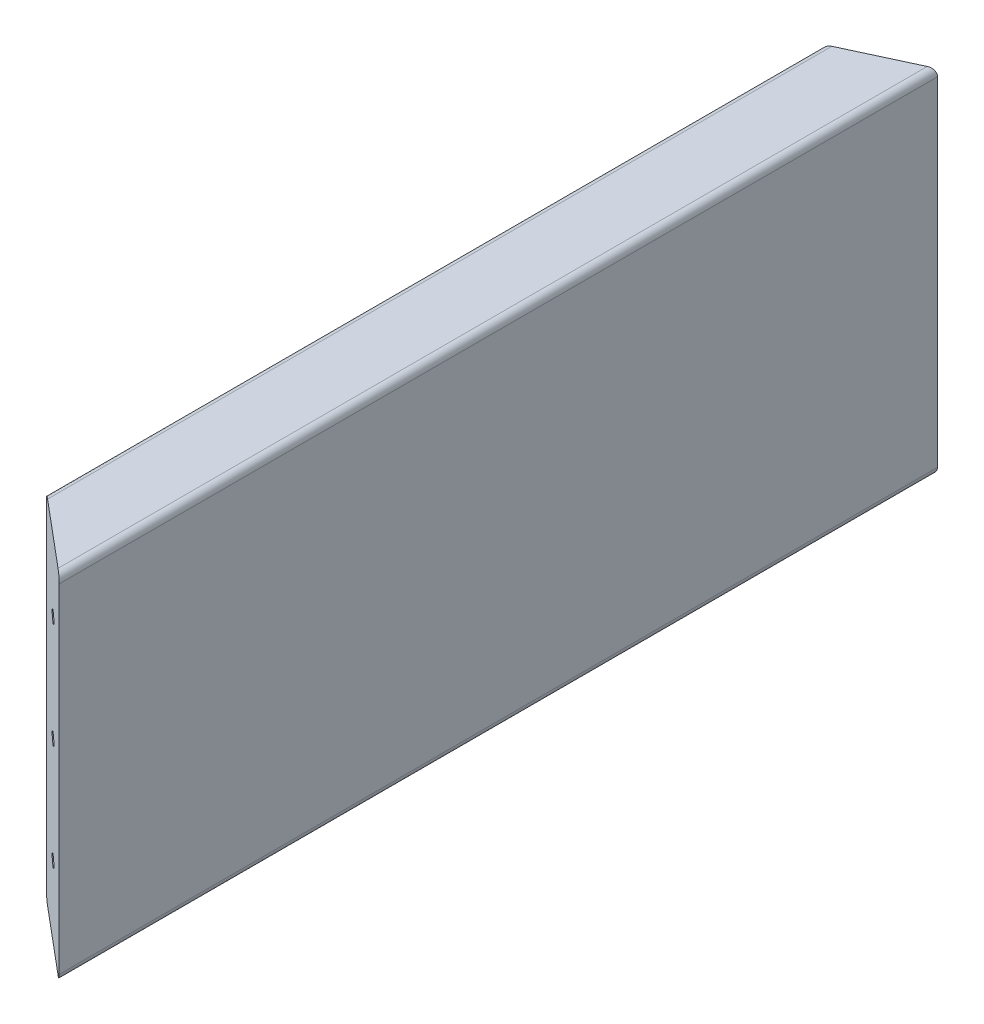
ISO-10303-21;
HEADER;
FILE_DESCRIPTION(('STEP AP214'),'2;1');
FILE_NAME('part.step','',(''),(''),'','','');
FILE_SCHEMA(('AUTOMOTIVE_DESIGN { 1 0 10303 214 1 1 1 1 }'));
ENDSEC;
DATA;
#1=APPLICATION_CONTEXT('core data for automotive mechanical design processes');
#2=APPLICATION_PROTOCOL_DEFINITION('international standard','automotive_design',2000,#1);
#3=PRODUCT_CONTEXT('',#1,'mechanical');
#4=PRODUCT('Part','Part','',(#3));
#5=PRODUCT_RELATED_PRODUCT_CATEGORY('part','',(#4));
#6=PRODUCT_DEFINITION_FORMATION('','',#4);
#7=PRODUCT_DEFINITION_CONTEXT('part definition',#1,'design');
#8=PRODUCT_DEFINITION('design','',#6,#7);
#9=PRODUCT_DEFINITION_SHAPE('','',#8);
#10=(LENGTH_UNIT() NAMED_UNIT(*) SI_UNIT(.MILLI.,.METRE.));
#11=(NAMED_UNIT(*) PLANE_ANGLE_UNIT() SI_UNIT($,.RADIAN.));
#12=(NAMED_UNIT(*) SI_UNIT($,.STERADIAN.) SOLID_ANGLE_UNIT());
#13=UNCERTAINTY_MEASURE_WITH_UNIT(LENGTH_MEASURE(1.E-05),#10,'distance_accuracy_value','');
#14=(GEOMETRIC_REPRESENTATION_CONTEXT(3) GLOBAL_UNCERTAINTY_ASSIGNED_CONTEXT((#13)) GLOBAL_UNIT_ASSIGNED_CONTEXT((#10,
#11,#12)) REPRESENTATION_CONTEXT('',''));
#15=CARTESIAN_POINT('',(0.,0.,0.));
#16=DIRECTION('',(0.,0.,1.));
#17=DIRECTION('',(1.,0.,0.));
#18=AXIS2_PLACEMENT_3D('',#15,#16,#17);
#19=CARTESIAN_POINT('',(-31.1882554112285,134.272684877163,510.));
#20=DIRECTION('',(0.,-1.,0.));
#21=DIRECTION('',(0.,0.,-1.));
#22=AXIS2_PLACEMENT_3D('',#19,#20,#21);
#23=PLANE('',#22);
#24=DIRECTION('',(0.907126965711573,0.,-0.420857063715122));
#25=VECTOR('',#24,1.);
#26=CARTESIAN_POINT('',(-217.92092886283,134.272684877163,107.511226324524));
#27=LINE('',#26,#25);
#28=CARTESIAN_POINT('',(-27.1882554112285,134.272684877163,19.0217469709818));
#29=VERTEX_POINT('',#28);
#30=CARTESIAN_POINT('',(9.81174458877147,134.272684877163,1.85578019229093));
#31=VERTEX_POINT('',#30);
#32=EDGE_CURVE('E49',#29,#31,#27,.T.);
#33=ORIENTED_EDGE('',*,*,#32,.F.);
#34=DIRECTION('',(0.,0.,-1.));
#35=VECTOR('',#34,1.);
#36=CARTESIAN_POINT('',(-27.1882554112285,134.272684877163,510.));
#37=LINE('',#36,#35);
#38=CARTESIAN_POINT('',(-27.1882554112285,134.272684877163,464.274109805575));
#39=VERTEX_POINT('',#38);
#40=EDGE_CURVE('E41',#29,#39,#37,.F.);
#41=ORIENTED_EDGE('',*,*,#40,.T.);
#42=DIRECTION('',(-0.766068203582476,0.,-0.642759292005894));
#43=VECTOR('',#42,1.);
#44=CARTESIAN_POINT('',(-7.02038536886983,134.272684877163,481.195691734014));
#45=LINE('',#44,#43);
#46=CARTESIAN_POINT('',(9.81174458877147,134.272684877163,495.318465507851));
#47=VERTEX_POINT('',#46);
#48=EDGE_CURVE('E216',#47,#39,#45,.T.);
#49=ORIENTED_EDGE('',*,*,#48,.F.);
#50=DIRECTION('',(0.,0.,-1.));
#51=VECTOR('',#50,1.);
#52=CARTESIAN_POINT('',(9.81174458877147,134.272684877163,510.));
#53=LINE('',#52,#51);
#54=EDGE_CURVE('E251',#47,#31,#53,.T.);
#55=ORIENTED_EDGE('',*,*,#54,.T.);
#56=EDGE_LOOP('',(#33,#41,#49,#55));
#57=FACE_BOUND('',#56,.T.);
#58=ADVANCED_FACE('F32',(#57),#23,.F.);
#59=CARTESIAN_POINT('',(-31.1882554112285,-65.7273151228369,510.));
#60=DIRECTION('',(0.,1.,0.));
#61=DIRECTION('',(0.,0.,1.));
#62=AXIS2_PLACEMENT_3D('',#59,#60,#61);
#63=PLANE('',#62);
#64=CARTESIAN_POINT('',(-8.11900232288232,-65.7273151228369,35.1370040691663));
#65=DIRECTION('',(0.,1.,0.));
#66=DIRECTION('',(0.,0.,1.));
#67=AXIS2_PLACEMENT_3D('',#64,#65,#66);
#68=CIRCLE('',#67,2.99999999999999);
#69=CARTESIAN_POINT('',(-8.11900232288232,-65.7273151228369,38.1370040691663));
#70=VERTEX_POINT('',#69);
#71=EDGE_CURVE('E36',#70,#70,#68,.T.);
#72=ORIENTED_EDGE('',*,*,#71,.T.);
#73=EDGE_LOOP('',(#72));
#74=FACE_BOUND('',#73,.T.);
#75=CARTESIAN_POINT('',(-8.08623886436544,-65.7273151228369,450.935611492298));
#76=DIRECTION('',(0.,1.,0.));
#77=DIRECTION('',(0.,0.,1.));
#78=AXIS2_PLACEMENT_3D('',#75,#76,#77);
#79=CIRCLE('',#78,2.99999999999999);
#80=CARTESIAN_POINT('',(-8.08623886436544,-65.7273151228369,453.935611492298));
#81=VERTEX_POINT('',#80);
#82=EDGE_CURVE('E144',#81,#81,#79,.T.);
#83=ORIENTED_EDGE('',*,*,#82,.T.);
#84=EDGE_LOOP('',(#83));
#85=FACE_BOUND('',#84,.T.);
#86=CARTESIAN_POINT('',(-8.11082335994362,-65.7273151228369,138.935612460884));
#87=DIRECTION('',(0.,1.,0.));
#88=DIRECTION('',(0.,0.,1.));
#89=AXIS2_PLACEMENT_3D('',#86,#87,#88);
#90=CIRCLE('',#89,2.99999999999999);
#91=CARTESIAN_POINT('',(-8.11082335994362,-65.7273151228369,141.935612460884));
#92=VERTEX_POINT('',#91);
#93=EDGE_CURVE('E148',#92,#92,#90,.T.);
#94=ORIENTED_EDGE('',*,*,#93,.T.);
#95=EDGE_LOOP('',(#94));
#96=FACE_BOUND('',#95,.T.);
#97=CARTESIAN_POINT('',(-8.10262852808386,-65.7273151228369,242.935612138022));
#98=DIRECTION('',(0.,1.,0.));
#99=DIRECTION('',(0.,0.,1.));
#100=AXIS2_PLACEMENT_3D('',#97,#98,#99);
#101=CIRCLE('',#100,2.99999999999999);
#102=CARTESIAN_POINT('',(-8.10262852808386,-65.7273151228369,245.935612138022));
#103=VERTEX_POINT('',#102);
#104=EDGE_CURVE('E152',#103,#103,#101,.T.);
#105=ORIENTED_EDGE('',*,*,#104,.T.);
#106=EDGE_LOOP('',(#105));
#107=FACE_BOUND('',#106,.T.);
#108=CARTESIAN_POINT('',(-8.09443369622476,-65.7273151228369,346.93561181516));
#109=DIRECTION('',(0.,1.,0.));
#110=DIRECTION('',(0.,0.,1.));
#111=AXIS2_PLACEMENT_3D('',#108,#109,#110);
#112=CIRCLE('',#111,2.99999999999999);
#113=CARTESIAN_POINT('',(-8.09443369622476,-65.7273151228369,349.93561181516));
#114=VERTEX_POINT('',#113);
#115=EDGE_CURVE('E156',#114,#114,#112,.T.);
#116=ORIENTED_EDGE('',*,*,#115,.T.);
#117=EDGE_LOOP('',(#116));
#118=FACE_BOUND('',#117,.T.);
#119=DIRECTION('',(-0.907126965711573,0.,0.420857063715122));
#120=VECTOR('',#119,1.);
#121=CARTESIAN_POINT('',(-217.92092886283,-65.7273151228369,107.511226324524));
#122=LINE('',#121,#120);
#123=CARTESIAN_POINT('',(9.81174458877147,-65.7273151228369,1.85578019229093));
#124=VERTEX_POINT('',#123);
#125=CARTESIAN_POINT('',(-27.1882554112285,-65.7273151228369,19.0217469709818));
#126=VERTEX_POINT('',#125);
#127=EDGE_CURVE('E208',#124,#126,#122,.T.);
#128=ORIENTED_EDGE('',*,*,#127,.F.);
#129=DIRECTION('',(0.,0.,-1.));
#130=VECTOR('',#129,1.);
#131=CARTESIAN_POINT('',(9.81174458877147,-65.7273151228369,510.));
#132=LINE('',#131,#130);
#133=CARTESIAN_POINT('',(9.81174458877147,-65.7273151228369,495.318465507851));
#134=VERTEX_POINT('',#133);
#135=EDGE_CURVE('E235',#124,#134,#132,.F.);
#136=ORIENTED_EDGE('',*,*,#135,.T.);
#137=DIRECTION('',(0.766068203582476,0.,0.642759292005894));
#138=VECTOR('',#137,1.);
#139=CARTESIAN_POINT('',(-7.02038536886982,-65.7273151228369,481.195691734014));
#140=LINE('',#139,#138);
#141=CARTESIAN_POINT('',(-27.1882554112285,-65.7273151228369,464.274109805575));
#142=VERTEX_POINT('',#141);
#143=EDGE_CURVE('E226',#142,#134,#140,.T.);
#144=ORIENTED_EDGE('',*,*,#143,.F.);
#145=DIRECTION('',(0.,0.,-1.));
#146=VECTOR('',#145,1.);
#147=CARTESIAN_POINT('',(-27.1882554112285,-65.7273151228369,510.));
#148=LINE('',#147,#146);
#149=EDGE_CURVE('E237',#142,#126,#148,.T.);
#150=ORIENTED_EDGE('',*,*,#149,.T.);
#151=EDGE_LOOP('',(#128,#136,#144,#150));
#152=FACE_BOUND('',#151,.T.);
#153=ADVANCED_FACE('F269',(#74,#85,#96,#107,#118,#152),#63,.F.);
#154=CARTESIAN_POINT('',(-27.1882554112285,-61.7273151228369,510.));
#155=DIRECTION('',(0.,0.,-1.));
#156=DIRECTION('',(-1.,0.,0.));
#157=AXIS2_PLACEMENT_3D('',#154,#155,#156);
#158=CYLINDRICAL_SURFACE('',#157,4.);
#159=DIRECTION('',(0.,0.,-1.));
#160=VECTOR('',#159,1.);
#161=CARTESIAN_POINT('',(-31.1882554112285,-61.7273151228369,510.));
#162=LINE('',#161,#160);
#163=CARTESIAN_POINT('',(-31.1882554112285,-61.7273151228369,20.8775271632726));
#164=VERTEX_POINT('',#163);
#165=CARTESIAN_POINT('',(-31.1882554112285,-61.7273151228369,460.917963243167));
#166=VERTEX_POINT('',#165);
#167=EDGE_CURVE('E243',#164,#166,#162,.F.);
#168=ORIENTED_EDGE('',*,*,#167,.F.);
#169=CARTESIAN_POINT('',(-27.1882554112285,-61.7273151228369,19.0217469709817));
#170=DIRECTION('',(-0.420857063715122,0.,-0.907126965711573));
#171=DIRECTION('',(0.907126965711573,0.,-0.420857063715122));
#172=AXIS2_PLACEMENT_3D('',#169,#170,#171);
#173=ELLIPSE('',#172,4.40952606547453,4.);
#174=EDGE_CURVE('E210',#164,#126,#173,.F.);
#175=ORIENTED_EDGE('',*,*,#174,.T.);
#176=ORIENTED_EDGE('',*,*,#149,.F.);
#177=CARTESIAN_POINT('',(-27.1882554112285,-61.7273151228369,464.274109805575));
#178=DIRECTION('',(-0.642759292005894,0.,0.766068203582476));
#179=DIRECTION('',(-0.766068203582476,0.,-0.642759292005894));
#180=AXIS2_PLACEMENT_3D('',#177,#178,#179);
#181=ELLIPSE('',#180,5.22146720265143,4.);
#182=EDGE_CURVE('E229',#142,#166,#181,.F.);
#183=ORIENTED_EDGE('',*,*,#182,.T.);
#184=EDGE_LOOP('',(#168,#175,#176,#183));
#185=FACE_BOUND('',#184,.T.);
#186=ADVANCED_FACE('F295',(#185),#158,.T.);
#187=CARTESIAN_POINT('',(9.81174458877148,-61.7273151228369,510.));
#188=DIRECTION('',(0.,0.,-1.));
#189=DIRECTION('',(-1.,0.,0.));
#190=AXIS2_PLACEMENT_3D('',#187,#188,#189);
#191=CYLINDRICAL_SURFACE('',#190,4.);
#192=ORIENTED_EDGE('',*,*,#135,.F.);
#193=CARTESIAN_POINT('',(9.81174458877148,-61.7273151228369,1.85578019229093));
#194=DIRECTION('',(-0.420857063715122,0.,-0.907126965711573));
#195=DIRECTION('',(0.907126965711573,0.,-0.420857063715122));
#196=AXIS2_PLACEMENT_3D('',#193,#194,#195);
#197=ELLIPSE('',#196,4.40952606547453,4.);
#198=CARTESIAN_POINT('',(13.8117445887715,-61.7273151228369,0.));
#199=VERTEX_POINT('',#198);
#200=EDGE_CURVE('E205',#124,#199,#197,.F.);
#201=ORIENTED_EDGE('',*,*,#200,.T.);
#202=DIRECTION('',(0.,0.,-1.));
#203=VECTOR('',#202,1.);
#204=CARTESIAN_POINT('',(13.8117445887715,-61.7273151228369,510.));
#205=LINE('',#204,#203);
#206=CARTESIAN_POINT('',(13.8117445887715,-61.7273151228369,498.674612070259));
#207=VERTEX_POINT('',#206);
#208=EDGE_CURVE('E248',#207,#199,#205,.T.);
#209=ORIENTED_EDGE('',*,*,#208,.F.);
#210=CARTESIAN_POINT('',(9.81174458877148,-61.7273151228369,495.318465507851));
#211=DIRECTION('',(-0.642759292005894,0.,0.766068203582476));
#212=DIRECTION('',(-0.766068203582476,0.,-0.642759292005894));
#213=AXIS2_PLACEMENT_3D('',#210,#211,#212);
#214=ELLIPSE('',#213,5.22146720265143,4.);
#215=EDGE_CURVE('E223',#207,#134,#214,.F.);
#216=ORIENTED_EDGE('',*,*,#215,.T.);
#217=EDGE_LOOP('',(#192,#201,#209,#216));
#218=FACE_BOUND('',#217,.T.);
#219=ADVANCED_FACE('F303',(#218),#191,.T.);
#220=CARTESIAN_POINT('',(-27.1882554112285,130.272684877163,510.));
#221=DIRECTION('',(0.,0.,-1.));
#222=DIRECTION('',(-1.,0.,0.));
#223=AXIS2_PLACEMENT_3D('',#220,#221,#222);
#224=CYLINDRICAL_SURFACE('',#223,4.);
#225=ORIENTED_EDGE('',*,*,#40,.F.);
#226=CARTESIAN_POINT('',(-27.1882554112285,130.272684877163,19.0217469709817));
#227=DIRECTION('',(-0.420857063715122,0.,-0.907126965711573));
#228=DIRECTION('',(0.907126965711573,0.,-0.420857063715122));
#229=AXIS2_PLACEMENT_3D('',#226,#227,#228);
#230=ELLIPSE('',#229,4.40952606547453,4.);
#231=CARTESIAN_POINT('',(-31.1882554112285,130.272684877163,20.8775271632726));
#232=VERTEX_POINT('',#231);
#233=EDGE_CURVE('E202',#29,#232,#230,.F.);
#234=ORIENTED_EDGE('',*,*,#233,.T.);
#235=DIRECTION('',(0.,0.,-1.));
#236=VECTOR('',#235,1.);
#237=CARTESIAN_POINT('',(-31.1882554112285,130.272684877163,510.));
#238=LINE('',#237,#236);
#239=CARTESIAN_POINT('',(-31.1882554112285,130.272684877163,460.917963243167));
#240=VERTEX_POINT('',#239);
#241=EDGE_CURVE('E240',#240,#232,#238,.T.);
#242=ORIENTED_EDGE('',*,*,#241,.F.);
#243=CARTESIAN_POINT('',(-27.1882554112285,130.272684877163,464.274109805575));
#244=DIRECTION('',(-0.642759292005894,0.,0.766068203582476));
#245=DIRECTION('',(-0.766068203582476,0.,-0.642759292005894));
#246=AXIS2_PLACEMENT_3D('',#243,#244,#245);
#247=ELLIPSE('',#246,5.22146720265143,4.);
#248=EDGE_CURVE('E220',#240,#39,#247,.F.);
#249=ORIENTED_EDGE('',*,*,#248,.T.);
#250=EDGE_LOOP('',(#225,#234,#242,#249));
#251=FACE_BOUND('',#250,.T.);
#252=ADVANCED_FACE('F306',(#251),#224,.T.);
#253=CARTESIAN_POINT('',(9.81174458877147,130.272684877163,510.));
#254=DIRECTION('',(0.,0.,-1.));
#255=DIRECTION('',(-1.,0.,0.));
#256=AXIS2_PLACEMENT_3D('',#253,#254,#255);
#257=CYLINDRICAL_SURFACE('',#256,4.);
#258=DIRECTION('',(0.,0.,-1.));
#259=VECTOR('',#258,1.);
#260=CARTESIAN_POINT('',(13.8117445887715,130.272684877163,510.));
#261=LINE('',#260,#259);
#262=CARTESIAN_POINT('',(13.8117445887715,130.272684877163,0.));
#263=VERTEX_POINT('',#262);
#264=CARTESIAN_POINT('',(13.8117445887715,130.272684877163,498.674612070259));
#265=VERTEX_POINT('',#264);
#266=EDGE_CURVE('E245',#263,#265,#261,.F.);
#267=ORIENTED_EDGE('',*,*,#266,.F.);
#268=CARTESIAN_POINT('',(9.81174458877147,130.272684877163,1.85578019229093));
#269=DIRECTION('',(-0.420857063715122,0.,-0.907126965711573));
#270=DIRECTION('',(0.907126965711573,0.,-0.420857063715122));
#271=AXIS2_PLACEMENT_3D('',#268,#269,#270);
#272=ELLIPSE('',#271,4.40952606547453,4.);
#273=EDGE_CURVE('E199',#263,#31,#272,.F.);
#274=ORIENTED_EDGE('',*,*,#273,.T.);
#275=ORIENTED_EDGE('',*,*,#54,.F.);
#276=CARTESIAN_POINT('',(9.81174458877147,130.272684877163,495.318465507851));
#277=DIRECTION('',(-0.642759292005894,0.,0.766068203582476));
#278=DIRECTION('',(-0.766068203582476,0.,-0.642759292005894));
#279=AXIS2_PLACEMENT_3D('',#276,#277,#278);
#280=ELLIPSE('',#279,5.22146720265143,4.);
#281=EDGE_CURVE('E11',#47,#265,#280,.F.);
#282=ORIENTED_EDGE('',*,*,#281,.T.);
#283=EDGE_LOOP('',(#267,#274,#275,#282));
#284=FACE_BOUND('',#283,.T.);
#285=ADVANCED_FACE('F34',(#284),#257,.T.);
#286=CARTESIAN_POINT('',(-31.1882554112285,134.272684877163,510.));
#287=DIRECTION('',(1.,0.,0.));
#288=DIRECTION('',(0.,1.,0.));
#289=AXIS2_PLACEMENT_3D('',#286,#287,#288);
#290=PLANE('',#289);
#291=ORIENTED_EDGE('',*,*,#241,.T.);
#292=DIRECTION('',(0.,-1.,0.));
#293=VECTOR('',#292,1.);
#294=CARTESIAN_POINT('',(-31.1882554112285,813.231799831734,20.8775271632727));
#295=LINE('',#294,#293);
#296=EDGE_CURVE('E196',#232,#164,#295,.T.);
#297=ORIENTED_EDGE('',*,*,#296,.T.);
#298=ORIENTED_EDGE('',*,*,#167,.T.);
#299=DIRECTION('',(0.,-1.,0.));
#300=VECTOR('',#299,1.);
#301=CARTESIAN_POINT('',(-31.1882554112285,821.346416364549,460.917963243167));
#302=LINE('',#301,#300);
#303=EDGE_CURVE('E213',#240,#166,#302,.T.);
#304=ORIENTED_EDGE('',*,*,#303,.F.);
#305=EDGE_LOOP('',(#291,#297,#298,#304));
#306=FACE_BOUND('',#305,.T.);
#307=ADVANCED_FACE('F300',(#306),#290,.F.);
#308=CARTESIAN_POINT('',(13.8117445887715,134.272684877163,510.));
#309=DIRECTION('',(-1.,0.,0.));
#310=DIRECTION('',(0.,0.,1.));
#311=AXIS2_PLACEMENT_3D('',#308,#309,#310);
#312=PLANE('',#311);
#313=ORIENTED_EDGE('',*,*,#266,.T.);
#314=DIRECTION('',(0.,-1.,0.));
#315=VECTOR('',#314,1.);
#316=CARTESIAN_POINT('',(13.8117445887715,821.346416364549,498.674612070259));
#317=LINE('',#316,#315);
#318=EDGE_CURVE('E57',#265,#207,#317,.T.);
#319=ORIENTED_EDGE('',*,*,#318,.T.);
#320=ORIENTED_EDGE('',*,*,#208,.T.);
#321=DIRECTION('',(0.,1.,0.));
#322=VECTOR('',#321,1.);
#323=CARTESIAN_POINT('',(13.8117445887715,134.272684877163,0.));
#324=LINE('',#323,#322);
#325=EDGE_CURVE('E232',#199,#263,#324,.T.);
#326=ORIENTED_EDGE('',*,*,#325,.T.);
#327=EDGE_LOOP('',(#313,#319,#320,#326));
#328=FACE_BOUND('',#327,.T.);
#329=ADVANCED_FACE('F322',(#328),#312,.F.);
#330=CARTESIAN_POINT('',(13.8117445887715,821.346416364549,498.674612070259));
#331=DIRECTION('',(-0.642759292005894,0.,0.766068203582476));
#332=DIRECTION('',(0.766068203582476,0.,0.642759292005894));
#333=AXIS2_PLACEMENT_3D('',#330,#331,#332);
#334=PLANE('',#333);
#335=CARTESIAN_POINT('',(-7.918215451858,94.2726848771541,480.442379397352));
#336=DIRECTION('',(-0.642759292005894,0.,0.766068203582476));
#337=DIRECTION('',(0.766068203582476,0.,0.642759292005894));
#338=AXIS2_PLACEMENT_3D('',#335,#336,#337);
#339=ELLIPSE('',#338,3.91610040198854,2.99999999999998);
#340=CARTESIAN_POINT('',(-4.91821545185802,94.2726848771541,482.959489319159));
#341=VERTEX_POINT('',#340);
#342=EDGE_CURVE('E160',#341,#341,#339,.T.);
#343=ORIENTED_EDGE('',*,*,#342,.F.);
#344=EDGE_LOOP('',(#343));
#345=FACE_BOUND('',#344,.T.);
#346=CARTESIAN_POINT('',(-7.918215451858,34.2726848771547,480.442379397352));
#347=DIRECTION('',(-0.642759292005894,0.,0.766068203582476));
#348=DIRECTION('',(0.766068203582476,0.,0.642759292005894));
#349=AXIS2_PLACEMENT_3D('',#346,#347,#348);
#350=ELLIPSE('',#349,3.91610040198854,2.99999999999998);
#351=CARTESIAN_POINT('',(-4.91821545185802,34.2726848771547,482.959489319159));
#352=VERTEX_POINT('',#351);
#353=EDGE_CURVE('E164',#352,#352,#350,.T.);
#354=ORIENTED_EDGE('',*,*,#353,.F.);
#355=EDGE_LOOP('',(#354));
#356=FACE_BOUND('',#355,.T.);
#357=CARTESIAN_POINT('',(-7.918215451858,-25.7273151228453,480.442379397352));
#358=DIRECTION('',(-0.642759292005894,0.,0.766068203582476));
#359=DIRECTION('',(0.766068203582476,0.,0.642759292005894));
#360=AXIS2_PLACEMENT_3D('',#357,#358,#359);
#361=ELLIPSE('',#360,3.91610040198854,2.99999999999998);
#362=CARTESIAN_POINT('',(-4.91821545185802,-25.7273151228453,482.959489319159));
#363=VERTEX_POINT('',#362);
#364=EDGE_CURVE('E168',#363,#363,#361,.T.);
#365=ORIENTED_EDGE('',*,*,#364,.F.);
#366=EDGE_LOOP('',(#365));
#367=FACE_BOUND('',#366,.T.);
#368=ORIENTED_EDGE('',*,*,#182,.F.);
#369=ORIENTED_EDGE('',*,*,#143,.T.);
#370=ORIENTED_EDGE('',*,*,#215,.F.);
#371=ORIENTED_EDGE('',*,*,#318,.F.);
#372=ORIENTED_EDGE('',*,*,#281,.F.);
#373=ORIENTED_EDGE('',*,*,#48,.T.);
#374=ORIENTED_EDGE('',*,*,#248,.F.);
#375=ORIENTED_EDGE('',*,*,#303,.T.);
#376=EDGE_LOOP('',(#368,#369,#370,#371,#372,#373,#374,#375));
#377=FACE_BOUND('',#376,.T.);
#378=ADVANCED_FACE('F318',(#345,#356,#367,#377),#334,.T.);
#379=CARTESIAN_POINT('',(-31.1882554112285,813.231799831734,20.8775271632727));
#380=DIRECTION('',(-0.420857063715122,0.,-0.907126965711573));
#381=DIRECTION('',(-0.907126965711573,0.,0.420857063715122));
#382=AXIS2_PLACEMENT_3D('',#379,#380,#381);
#383=PLANE('',#382);
#384=CARTESIAN_POINT('',(-10.7778986827183,-25.7273151228369,11.4082432296824));
#385=DIRECTION('',(-0.420857063715122,0.,-0.907126965711573));
#386=DIRECTION('',(-0.907126965711573,0.,0.420857063715122));
#387=AXIS2_PLACEMENT_3D('',#384,#385,#386);
#388=CIRCLE('',#387,4.025);
#389=CARTESIAN_POINT('',(-14.4290847197074,-25.7273151228369,13.1021929111357));
#390=VERTEX_POINT('',#389);
#391=EDGE_CURVE('E169',#390,#390,#388,.T.);
#392=ORIENTED_EDGE('',*,*,#391,.F.);
#393=EDGE_LOOP('',(#392));
#394=FACE_BOUND('',#393,.T.);
#395=CARTESIAN_POINT('',(-10.7778986827183,34.2726848771631,11.4082432296824));
#396=DIRECTION('',(-0.420857063715122,0.,-0.907126965711573));
#397=DIRECTION('',(-0.907126965711573,0.,0.420857063715122));
#398=AXIS2_PLACEMENT_3D('',#395,#396,#397);
#399=CIRCLE('',#398,4.025);
#400=CARTESIAN_POINT('',(-14.4290847197074,34.2726848771631,13.1021929111357));
#401=VERTEX_POINT('',#400);
#402=EDGE_CURVE('E178',#401,#401,#399,.T.);
#403=ORIENTED_EDGE('',*,*,#402,.F.);
#404=EDGE_LOOP('',(#403));
#405=FACE_BOUND('',#404,.T.);
#406=CARTESIAN_POINT('',(-10.7778986827183,94.2726848771631,11.4082432296824));
#407=DIRECTION('',(-0.420857063715122,0.,-0.907126965711573));
#408=DIRECTION('',(-0.907126965711573,0.,0.420857063715122));
#409=AXIS2_PLACEMENT_3D('',#406,#407,#408);
#410=CIRCLE('',#409,4.025);
#411=CARTESIAN_POINT('',(-14.4290847197074,94.2726848771631,13.1021929111357));
#412=VERTEX_POINT('',#411);
#413=EDGE_CURVE('E187',#412,#412,#410,.T.);
#414=ORIENTED_EDGE('',*,*,#413,.F.);
#415=EDGE_LOOP('',(#414));
#416=FACE_BOUND('',#415,.T.);
#417=ORIENTED_EDGE('',*,*,#174,.F.);
#418=ORIENTED_EDGE('',*,*,#296,.F.);
#419=ORIENTED_EDGE('',*,*,#233,.F.);
#420=ORIENTED_EDGE('',*,*,#32,.T.);
#421=ORIENTED_EDGE('',*,*,#273,.F.);
#422=ORIENTED_EDGE('',*,*,#325,.F.);
#423=ORIENTED_EDGE('',*,*,#200,.F.);
#424=ORIENTED_EDGE('',*,*,#127,.T.);
#425=EDGE_LOOP('',(#417,#418,#419,#420,#421,#422,#423,#424));
#426=FACE_BOUND('',#425,.T.);
#427=ADVANCED_FACE('F324',(#394,#405,#416,#426),#383,.T.);
#428=CARTESIAN_POINT('',(-1.26797783314418,94.2726848771631,31.9061898918555));
#429=DIRECTION('',(-0.420857063715122,0.,-0.907126965711573));
#430=DIRECTION('',(-0.907126965711573,0.,0.420857063715122));
#431=AXIS2_PLACEMENT_3D('',#428,#429,#430);
#432=CONICAL_SURFACE('',#431,3.99999999999999,1.02974425867665);
#433=CARTESIAN_POINT('',(-0.256472089840226,94.2726848771631,34.0864173724717));
#434=VERTEX_POINT('',#433);
#435=VERTEX_LOOP('',#434);
#436=FACE_BOUND('',#435,.T.);
#437=CARTESIAN_POINT('',(-1.26797783314418,94.2726848771631,31.9061898918555));
#438=DIRECTION('',(-0.420857063715122,0.,-0.907126965711573));
#439=DIRECTION('',(-0.907126965711573,0.,0.420857063715122));
#440=AXIS2_PLACEMENT_3D('',#437,#438,#439);
#441=CIRCLE('',#440,3.99999999999999);
#442=CARTESIAN_POINT('',(-4.89648569599047,94.2726848771631,33.589618146716));
#443=VERTEX_POINT('',#442);
#444=EDGE_CURVE('E193',#443,#443,#441,.T.);
#445=ORIENTED_EDGE('',*,*,#444,.T.);
#446=EDGE_LOOP('',(#445));
#447=FACE_BOUND('',#446,.T.);
#448=ADVANCED_FACE('F345',(#436,#447),#432,.F.);
#449=CARTESIAN_POINT('',(-10.7778986827183,94.2726848771631,11.4082432296824));
#450=DIRECTION('',(-0.420857063715122,0.,-0.907126965711573));
#451=DIRECTION('',(-0.907126965711573,0.,0.420857063715122));
#452=AXIS2_PLACEMENT_3D('',#449,#450,#451);
#453=CYLINDRICAL_SURFACE('',#452,3.99999999999999);
#454=ORIENTED_EDGE('',*,*,#444,.F.);
#455=EDGE_LOOP('',(#454));
#456=FACE_BOUND('',#455,.T.);
#457=CARTESIAN_POINT('',(-10.7673772561254,94.2726848771631,11.4309214038252));
#458=DIRECTION('',(-0.420857063715122,0.,-0.907126965711573));
#459=DIRECTION('',(-0.907126965711573,0.,0.420857063715122));
#460=AXIS2_PLACEMENT_3D('',#457,#458,#459);
#461=CIRCLE('',#460,3.99999999999999);
#462=CARTESIAN_POINT('',(-14.3958851189717,94.2726848771631,13.1143496586857));
#463=VERTEX_POINT('',#462);
#464=EDGE_CURVE('E190',#463,#463,#461,.T.);
#465=ORIENTED_EDGE('',*,*,#464,.T.);
#466=EDGE_LOOP('',(#465));
#467=FACE_BOUND('',#466,.T.);
#468=ADVANCED_FACE('F349',(#456,#467),#453,.F.);
#469=CARTESIAN_POINT('',(-10.7778986827183,94.2726848771631,11.4082432296824));
#470=DIRECTION('',(-0.420857063715122,0.,-0.907126965711573));
#471=DIRECTION('',(-0.907126965711573,0.,0.420857063715122));
#472=AXIS2_PLACEMENT_3D('',#469,#470,#471);
#473=CONICAL_SURFACE('',#472,4.025,0.785398163397429);
#474=ORIENTED_EDGE('',*,*,#464,.F.);
#475=EDGE_LOOP('',(#474));
#476=FACE_BOUND('',#475,.T.);
#477=ORIENTED_EDGE('',*,*,#413,.T.);
#478=EDGE_LOOP('',(#477));
#479=FACE_BOUND('',#478,.T.);
#480=ADVANCED_FACE('F353',(#476,#479),#473,.F.);
#481=CARTESIAN_POINT('',(-1.26797783314418,34.2726848771631,31.9061898918555));
#482=DIRECTION('',(-0.420857063715122,0.,-0.907126965711573));
#483=DIRECTION('',(-0.907126965711573,0.,0.420857063715122));
#484=AXIS2_PLACEMENT_3D('',#481,#482,#483);
#485=CONICAL_SURFACE('',#484,4.,1.02974425867665);
#486=CARTESIAN_POINT('',(-0.256472089840226,34.2726848771631,34.0864173724717));
#487=VERTEX_POINT('',#486);
#488=VERTEX_LOOP('',#487);
#489=FACE_BOUND('',#488,.T.);
#490=CARTESIAN_POINT('',(-1.26797783314418,34.2726848771631,31.9061898918555));
#491=DIRECTION('',(-0.420857063715122,0.,-0.907126965711573));
#492=DIRECTION('',(-0.907126965711573,0.,0.420857063715122));
#493=AXIS2_PLACEMENT_3D('',#490,#491,#492);
#494=CIRCLE('',#493,4.);
#495=CARTESIAN_POINT('',(-4.89648569599047,34.2726848771631,33.589618146716));
#496=VERTEX_POINT('',#495);
#497=EDGE_CURVE('E184',#496,#496,#494,.T.);
#498=ORIENTED_EDGE('',*,*,#497,.T.);
#499=EDGE_LOOP('',(#498));
#500=FACE_BOUND('',#499,.T.);
#501=ADVANCED_FACE('F357',(#489,#500),#485,.F.);
#502=CARTESIAN_POINT('',(-10.7778986827183,34.2726848771631,11.4082432296824));
#503=DIRECTION('',(-0.420857063715122,0.,-0.907126965711573));
#504=DIRECTION('',(-0.907126965711573,0.,0.420857063715122));
#505=AXIS2_PLACEMENT_3D('',#502,#503,#504);
#506=CYLINDRICAL_SURFACE('',#505,3.99999999999999);
#507=ORIENTED_EDGE('',*,*,#497,.F.);
#508=EDGE_LOOP('',(#507));
#509=FACE_BOUND('',#508,.T.);
#510=CARTESIAN_POINT('',(-10.7673772561254,34.2726848771631,11.4309214038252));
#511=DIRECTION('',(-0.420857063715122,0.,-0.907126965711573));
#512=DIRECTION('',(-0.907126965711573,0.,0.420857063715122));
#513=AXIS2_PLACEMENT_3D('',#510,#511,#512);
#514=CIRCLE('',#513,3.99999999999999);
#515=CARTESIAN_POINT('',(-14.3958851189717,34.2726848771631,13.1143496586857));
#516=VERTEX_POINT('',#515);
#517=EDGE_CURVE('E181',#516,#516,#514,.T.);
#518=ORIENTED_EDGE('',*,*,#517,.T.);
#519=EDGE_LOOP('',(#518));
#520=FACE_BOUND('',#519,.T.);
#521=ADVANCED_FACE('F361',(#509,#520),#506,.F.);
#522=CARTESIAN_POINT('',(-10.7778986827183,34.2726848771631,11.4082432296824));
#523=DIRECTION('',(-0.420857063715122,0.,-0.907126965711573));
#524=DIRECTION('',(-0.907126965711573,0.,0.420857063715122));
#525=AXIS2_PLACEMENT_3D('',#522,#523,#524);
#526=CONICAL_SURFACE('',#525,4.025,0.785398163397429);
#527=ORIENTED_EDGE('',*,*,#517,.F.);
#528=EDGE_LOOP('',(#527));
#529=FACE_BOUND('',#528,.T.);
#530=ORIENTED_EDGE('',*,*,#402,.T.);
#531=EDGE_LOOP('',(#530));
#532=FACE_BOUND('',#531,.T.);
#533=ADVANCED_FACE('F365',(#529,#532),#526,.F.);
#534=CARTESIAN_POINT('',(-1.26797783314418,-25.7273151228369,31.9061898918555));
#535=DIRECTION('',(-0.420857063715122,0.,-0.907126965711573));
#536=DIRECTION('',(-0.907126965711573,0.,0.420857063715122));
#537=AXIS2_PLACEMENT_3D('',#534,#535,#536);
#538=CONICAL_SURFACE('',#537,3.99999999999999,1.02974425867665);
#539=CARTESIAN_POINT('',(-0.256472089840226,-25.7273151228369,34.0864173724717));
#540=VERTEX_POINT('',#539);
#541=VERTEX_LOOP('',#540);
#542=FACE_BOUND('',#541,.T.);
#543=CARTESIAN_POINT('',(-1.26797783314418,-25.7273151228369,31.9061898918555));
#544=DIRECTION('',(-0.420857063715122,0.,-0.907126965711573));
#545=DIRECTION('',(-0.907126965711573,0.,0.420857063715122));
#546=AXIS2_PLACEMENT_3D('',#543,#544,#545);
#547=CIRCLE('',#546,3.99999999999999);
#548=CARTESIAN_POINT('',(-4.89648569599047,-25.7273151228369,33.589618146716));
#549=VERTEX_POINT('',#548);
#550=EDGE_CURVE('E175',#549,#549,#547,.T.);
#551=ORIENTED_EDGE('',*,*,#550,.T.);
#552=EDGE_LOOP('',(#551));
#553=FACE_BOUND('',#552,.T.);
#554=ADVANCED_FACE('F369',(#542,#553),#538,.F.);
#555=CARTESIAN_POINT('',(-10.7778986827183,-25.7273151228369,11.4082432296824));
#556=DIRECTION('',(-0.420857063715122,0.,-0.907126965711573));
#557=DIRECTION('',(-0.907126965711573,0.,0.420857063715122));
#558=AXIS2_PLACEMENT_3D('',#555,#556,#557);
#559=CYLINDRICAL_SURFACE('',#558,3.99999999999999);
#560=ORIENTED_EDGE('',*,*,#550,.F.);
#561=EDGE_LOOP('',(#560));
#562=FACE_BOUND('',#561,.T.);
#563=CARTESIAN_POINT('',(-10.7673772561254,-25.7273151228369,11.4309214038252));
#564=DIRECTION('',(-0.420857063715122,0.,-0.907126965711573));
#565=DIRECTION('',(-0.907126965711573,0.,0.420857063715122));
#566=AXIS2_PLACEMENT_3D('',#563,#564,#565);
#567=CIRCLE('',#566,3.99999999999999);
#568=CARTESIAN_POINT('',(-14.3958851189717,-25.7273151228369,13.1143496586857));
#569=VERTEX_POINT('',#568);
#570=EDGE_CURVE('E172',#569,#569,#567,.T.);
#571=ORIENTED_EDGE('',*,*,#570,.T.);
#572=EDGE_LOOP('',(#571));
#573=FACE_BOUND('',#572,.T.);
#574=ADVANCED_FACE('F373',(#562,#573),#559,.F.);
#575=CARTESIAN_POINT('',(-10.7778986827183,-25.7273151228369,11.4082432296824));
#576=DIRECTION('',(-0.420857063715122,0.,-0.907126965711573));
#577=DIRECTION('',(-0.907126965711573,0.,0.420857063715122));
#578=AXIS2_PLACEMENT_3D('',#575,#576,#577);
#579=CONICAL_SURFACE('',#578,4.025,0.785398163397429);
#580=ORIENTED_EDGE('',*,*,#570,.F.);
#581=EDGE_LOOP('',(#580));
#582=FACE_BOUND('',#581,.T.);
#583=ORIENTED_EDGE('',*,*,#391,.T.);
#584=EDGE_LOOP('',(#583));
#585=FACE_BOUND('',#584,.T.);
#586=ADVANCED_FACE('F377',(#582,#585),#579,.F.);
#587=CARTESIAN_POINT('',(-7.918215451858,-25.7273151228453,438.26600215934));
#588=DIRECTION('',(0.,0.,1.));
#589=DIRECTION('',(1.,0.,0.));
#590=AXIS2_PLACEMENT_3D('',#587,#588,#589);
#591=CONICAL_SURFACE('',#590,2.99999999999997,1.02974425867664);
#592=CARTESIAN_POINT('',(-7.91821545185803,-25.7273151228453,436.463420302257));
#593=VERTEX_POINT('',#592);
#594=VERTEX_LOOP('',#593);
#595=FACE_BOUND('',#594,.T.);
#596=CARTESIAN_POINT('',(-7.918215451858,-25.7273151228453,438.26600215934));
#597=DIRECTION('',(0.,0.,1.));
#598=DIRECTION('',(1.,0.,0.));
#599=AXIS2_PLACEMENT_3D('',#596,#597,#598);
#600=CIRCLE('',#599,2.99999999999997);
#601=CARTESIAN_POINT('',(-4.91821545185803,-25.7273151228453,438.26600215934));
#602=VERTEX_POINT('',#601);
#603=EDGE_CURVE('E165',#602,#602,#600,.T.);
#604=ORIENTED_EDGE('',*,*,#603,.T.);
#605=EDGE_LOOP('',(#604));
#606=FACE_BOUND('',#605,.T.);
#607=ADVANCED_FACE('F381',(#595,#606),#591,.F.);
#608=CARTESIAN_POINT('',(-7.918215451858,-25.7273151228453,566.463420302257));
#609=DIRECTION('',(0.,0.,1.));
#610=DIRECTION('',(1.,0.,0.));
#611=AXIS2_PLACEMENT_3D('',#608,#609,#610);
#612=CYLINDRICAL_SURFACE('',#611,2.99999999999998);
#613=ORIENTED_EDGE('',*,*,#364,.T.);
#614=EDGE_LOOP('',(#613));
#615=FACE_BOUND('',#614,.T.);
#616=ORIENTED_EDGE('',*,*,#603,.F.);
#617=EDGE_LOOP('',(#616));
#618=FACE_BOUND('',#617,.T.);
#619=ADVANCED_FACE('F385',(#615,#618),#612,.F.);
#620=CARTESIAN_POINT('',(-7.918215451858,34.2726848771547,438.26600215934));
#621=DIRECTION('',(0.,0.,1.));
#622=DIRECTION('',(1.,0.,0.));
#623=AXIS2_PLACEMENT_3D('',#620,#621,#622);
#624=CONICAL_SURFACE('',#623,2.99999999999997,1.02974425867664);
#625=CARTESIAN_POINT('',(-7.91821545185803,34.2726848771547,436.463420302257));
#626=VERTEX_POINT('',#625);
#627=VERTEX_LOOP('',#626);
#628=FACE_BOUND('',#627,.T.);
#629=CARTESIAN_POINT('',(-7.918215451858,34.2726848771547,438.26600215934));
#630=DIRECTION('',(0.,0.,1.));
#631=DIRECTION('',(1.,0.,0.));
#632=AXIS2_PLACEMENT_3D('',#629,#630,#631);
#633=CIRCLE('',#632,2.99999999999997);
#634=CARTESIAN_POINT('',(-4.91821545185803,34.2726848771547,438.26600215934));
#635=VERTEX_POINT('',#634);
#636=EDGE_CURVE('E161',#635,#635,#633,.T.);
#637=ORIENTED_EDGE('',*,*,#636,.T.);
#638=EDGE_LOOP('',(#637));
#639=FACE_BOUND('',#638,.T.);
#640=ADVANCED_FACE('F389',(#628,#639),#624,.F.);
#641=CARTESIAN_POINT('',(-7.918215451858,34.2726848771547,566.463420302257));
#642=DIRECTION('',(0.,0.,1.));
#643=DIRECTION('',(1.,0.,0.));
#644=AXIS2_PLACEMENT_3D('',#641,#642,#643);
#645=CYLINDRICAL_SURFACE('',#644,2.99999999999998);
#646=ORIENTED_EDGE('',*,*,#353,.T.);
#647=EDGE_LOOP('',(#646));
#648=FACE_BOUND('',#647,.T.);
#649=ORIENTED_EDGE('',*,*,#636,.F.);
#650=EDGE_LOOP('',(#649));
#651=FACE_BOUND('',#650,.T.);
#652=ADVANCED_FACE('F393',(#648,#651),#645,.F.);
#653=CARTESIAN_POINT('',(-7.918215451858,94.2726848771541,438.26600215934));
#654=DIRECTION('',(0.,0.,1.));
#655=DIRECTION('',(1.,0.,0.));
#656=AXIS2_PLACEMENT_3D('',#653,#654,#655);
#657=CONICAL_SURFACE('',#656,2.99999999999997,1.02974425867664);
#658=CARTESIAN_POINT('',(-7.91821545185803,94.2726848771541,436.463420302257));
#659=VERTEX_POINT('',#658);
#660=VERTEX_LOOP('',#659);
#661=FACE_BOUND('',#660,.T.);
#662=CARTESIAN_POINT('',(-7.918215451858,94.2726848771541,438.26600215934));
#663=DIRECTION('',(0.,0.,1.));
#664=DIRECTION('',(1.,0.,0.));
#665=AXIS2_PLACEMENT_3D('',#662,#663,#664);
#666=CIRCLE('',#665,2.99999999999997);
#667=CARTESIAN_POINT('',(-4.91821545185803,94.2726848771541,438.26600215934));
#668=VERTEX_POINT('',#667);
#669=EDGE_CURVE('E157',#668,#668,#666,.T.);
#670=ORIENTED_EDGE('',*,*,#669,.T.);
#671=EDGE_LOOP('',(#670));
#672=FACE_BOUND('',#671,.T.);
#673=ADVANCED_FACE('F397',(#661,#672),#657,.F.);
#674=CARTESIAN_POINT('',(-7.918215451858,94.2726848771541,566.463420302257));
#675=DIRECTION('',(0.,0.,1.));
#676=DIRECTION('',(1.,0.,0.));
#677=AXIS2_PLACEMENT_3D('',#674,#675,#676);
#678=CYLINDRICAL_SURFACE('',#677,2.99999999999998);
#679=ORIENTED_EDGE('',*,*,#342,.T.);
#680=EDGE_LOOP('',(#679));
#681=FACE_BOUND('',#680,.T.);
#682=ORIENTED_EDGE('',*,*,#669,.F.);
#683=EDGE_LOOP('',(#682));
#684=FACE_BOUND('',#683,.T.);
#685=ADVANCED_FACE('F401',(#681,#684),#678,.F.);
#686=CARTESIAN_POINT('',(-8.09443369622476,-77.7273151226701,346.93561181516));
#687=DIRECTION('',(0.,-1.,0.));
#688=DIRECTION('',(0.,0.,-1.));
#689=AXIS2_PLACEMENT_3D('',#686,#687,#688);
#690=CYLINDRICAL_SURFACE('',#689,2.99999999999999);
#691=CARTESIAN_POINT('',(-8.09443369622476,-49.5298969797528,346.93561181516));
#692=DIRECTION('',(0.,-1.,0.));
#693=DIRECTION('',(0.,0.,-1.));
#694=AXIS2_PLACEMENT_3D('',#691,#692,#693);
#695=CIRCLE('',#694,2.99999999999999);
#696=CARTESIAN_POINT('',(-8.09443369622476,-49.5298969797528,343.93561181516));
#697=VERTEX_POINT('',#696);
#698=EDGE_CURVE('E153',#697,#697,#695,.T.);
#699=ORIENTED_EDGE('',*,*,#698,.F.);
#700=EDGE_LOOP('',(#699));
#701=FACE_BOUND('',#700,.T.);
#702=ORIENTED_EDGE('',*,*,#115,.F.);
#703=EDGE_LOOP('',(#702));
#704=FACE_BOUND('',#703,.T.);
#705=ADVANCED_FACE('F405',(#701,#704),#690,.F.);
#706=CARTESIAN_POINT('',(-8.09443369622476,-49.5298969797528,346.93561181516));
#707=DIRECTION('',(0.,-1.,0.));
#708=DIRECTION('',(0.,0.,-1.));
#709=AXIS2_PLACEMENT_3D('',#706,#707,#708);
#710=CONICAL_SURFACE('',#709,2.99999999999999,1.02974425867665);
#711=CARTESIAN_POINT('',(-8.09443369622476,-47.7273151226701,346.93561181516));
#712=VERTEX_POINT('',#711);
#713=VERTEX_LOOP('',#712);
#714=FACE_BOUND('',#713,.T.);
#715=ORIENTED_EDGE('',*,*,#698,.T.);
#716=EDGE_LOOP('',(#715));
#717=FACE_BOUND('',#716,.T.);
#718=ADVANCED_FACE('F407',(#714,#717),#710,.F.);
#719=CARTESIAN_POINT('',(-8.10262852808386,-77.7273151226699,242.935612138022));
#720=DIRECTION('',(0.,-1.,0.));
#721=DIRECTION('',(0.,0.,-1.));
#722=AXIS2_PLACEMENT_3D('',#719,#720,#721);
#723=CYLINDRICAL_SURFACE('',#722,2.99999999999999);
#724=CARTESIAN_POINT('',(-8.10262852808386,-49.5298969797526,242.935612138022));
#725=DIRECTION('',(0.,-1.,0.));
#726=DIRECTION('',(0.,0.,-1.));
#727=AXIS2_PLACEMENT_3D('',#724,#725,#726);
#728=CIRCLE('',#727,2.99999999999999);
#729=CARTESIAN_POINT('',(-8.10262852808386,-49.5298969797526,239.935612138022));
#730=VERTEX_POINT('',#729);
#731=EDGE_CURVE('E149',#730,#730,#728,.T.);
#732=ORIENTED_EDGE('',*,*,#731,.F.);
#733=EDGE_LOOP('',(#732));
#734=FACE_BOUND('',#733,.T.);
#735=ORIENTED_EDGE('',*,*,#104,.F.);
#736=EDGE_LOOP('',(#735));
#737=FACE_BOUND('',#736,.T.);
#738=ADVANCED_FACE('F410',(#734,#737),#723,.F.);
#739=CARTESIAN_POINT('',(-8.10262852808386,-49.5298969797526,242.935612138022));
#740=DIRECTION('',(0.,-1.,0.));
#741=DIRECTION('',(0.,0.,-1.));
#742=AXIS2_PLACEMENT_3D('',#739,#740,#741);
#743=CONICAL_SURFACE('',#742,2.99999999999999,1.02974425867665);
#744=CARTESIAN_POINT('',(-8.10262852808386,-47.7273151226699,242.935612138022));
#745=VERTEX_POINT('',#744);
#746=VERTEX_LOOP('',#745);
#747=FACE_BOUND('',#746,.T.);
#748=ORIENTED_EDGE('',*,*,#731,.T.);
#749=EDGE_LOOP('',(#748));
#750=FACE_BOUND('',#749,.T.);
#751=ADVANCED_FACE('F415',(#747,#750),#743,.F.);
#752=CARTESIAN_POINT('',(-8.11082335994362,-77.7273151226697,138.935612460884));
#753=DIRECTION('',(0.,-1.,0.));
#754=DIRECTION('',(0.,0.,-1.));
#755=AXIS2_PLACEMENT_3D('',#752,#753,#754);
#756=CYLINDRICAL_SURFACE('',#755,2.99999999999999);
#757=CARTESIAN_POINT('',(-8.11082335994362,-49.5298969797524,138.935612460884));
#758=DIRECTION('',(0.,-1.,0.));
#759=DIRECTION('',(0.,0.,-1.));
#760=AXIS2_PLACEMENT_3D('',#757,#758,#759);
#761=CIRCLE('',#760,2.99999999999999);
#762=CARTESIAN_POINT('',(-8.11082335994362,-49.5298969797524,135.935612460884));
#763=VERTEX_POINT('',#762);
#764=EDGE_CURVE('E145',#763,#763,#761,.T.);
#765=ORIENTED_EDGE('',*,*,#764,.F.);
#766=EDGE_LOOP('',(#765));
#767=FACE_BOUND('',#766,.T.);
#768=ORIENTED_EDGE('',*,*,#93,.F.);
#769=EDGE_LOOP('',(#768));
#770=FACE_BOUND('',#769,.T.);
#771=ADVANCED_FACE('F284',(#767,#770),#756,.F.);
#772=CARTESIAN_POINT('',(-8.11082335994362,-49.5298969797524,138.935612460884));
#773=DIRECTION('',(0.,-1.,0.));
#774=DIRECTION('',(0.,0.,-1.));
#775=AXIS2_PLACEMENT_3D('',#772,#773,#774);
#776=CONICAL_SURFACE('',#775,2.99999999999999,1.02974425867665);
#777=CARTESIAN_POINT('',(-8.11082335994363,-47.7273151226697,138.935612460884));
#778=VERTEX_POINT('',#777);
#779=VERTEX_LOOP('',#778);
#780=FACE_BOUND('',#779,.T.);
#781=ORIENTED_EDGE('',*,*,#764,.T.);
#782=EDGE_LOOP('',(#781));
#783=FACE_BOUND('',#782,.T.);
#784=ADVANCED_FACE('F275',(#780,#783),#776,.F.);
#785=CARTESIAN_POINT('',(-8.08623886436544,-77.7273151226703,450.935611492298));
#786=DIRECTION('',(0.,-1.,0.));
#787=DIRECTION('',(0.,0.,-1.));
#788=AXIS2_PLACEMENT_3D('',#785,#786,#787);
#789=CYLINDRICAL_SURFACE('',#788,2.99999999999999);
#790=CARTESIAN_POINT('',(-8.08623886436544,-49.529896979753,450.935611492298));
#791=DIRECTION('',(0.,-1.,0.));
#792=DIRECTION('',(0.,0.,-1.));
#793=AXIS2_PLACEMENT_3D('',#790,#791,#792);
#794=CIRCLE('',#793,2.99999999999999);
#795=CARTESIAN_POINT('',(-8.08623886436544,-49.529896979753,447.935611492298));
#796=VERTEX_POINT('',#795);
#797=EDGE_CURVE('E140',#796,#796,#794,.T.);
#798=ORIENTED_EDGE('',*,*,#797,.F.);
#799=EDGE_LOOP('',(#798));
#800=FACE_BOUND('',#799,.T.);
#801=ORIENTED_EDGE('',*,*,#82,.F.);
#802=EDGE_LOOP('',(#801));
#803=FACE_BOUND('',#802,.T.);
#804=ADVANCED_FACE('F272',(#800,#803),#789,.F.);
#805=CARTESIAN_POINT('',(-8.08623886436544,-49.529896979753,450.935611492298));
#806=DIRECTION('',(0.,-1.,0.));
#807=DIRECTION('',(0.,0.,-1.));
#808=AXIS2_PLACEMENT_3D('',#805,#806,#807);
#809=CONICAL_SURFACE('',#808,2.99999999999999,1.02974425867665);
#810=CARTESIAN_POINT('',(-8.08623886436544,-47.7273151226703,450.935611492298));
#811=VERTEX_POINT('',#810);
#812=VERTEX_LOOP('',#811);
#813=FACE_BOUND('',#812,.T.);
#814=ORIENTED_EDGE('',*,*,#797,.T.);
#815=EDGE_LOOP('',(#814));
#816=FACE_BOUND('',#815,.T.);
#817=ADVANCED_FACE('F274',(#813,#816),#809,.F.);
#818=CARTESIAN_POINT('',(-8.11900232288232,-77.7273151226695,35.1370040691663));
#819=DIRECTION('',(0.,-1.,0.));
#820=DIRECTION('',(0.,0.,-1.));
#821=AXIS2_PLACEMENT_3D('',#818,#819,#820);
#822=CYLINDRICAL_SURFACE('',#821,2.99999999999999);
#823=CARTESIAN_POINT('',(-8.11900232288232,-49.5298969797522,35.1370040691663));
#824=DIRECTION('',(0.,-1.,0.));
#825=DIRECTION('',(0.,0.,-1.));
#826=AXIS2_PLACEMENT_3D('',#823,#824,#825);
#827=CIRCLE('',#826,2.99999999999999);
#828=CARTESIAN_POINT('',(-8.11900232288232,-49.5298969797522,32.1370040691663));
#829=VERTEX_POINT('',#828);
#830=EDGE_CURVE('E136',#829,#829,#827,.T.);
#831=ORIENTED_EDGE('',*,*,#830,.F.);
#832=EDGE_LOOP('',(#831));
#833=FACE_BOUND('',#832,.T.);
#834=ORIENTED_EDGE('',*,*,#71,.F.);
#835=EDGE_LOOP('',(#834));
#836=FACE_BOUND('',#835,.T.);
#837=ADVANCED_FACE('F132',(#833,#836),#822,.F.);
#838=CARTESIAN_POINT('',(-8.11900232288232,-49.5298969797522,35.1370040691663));
#839=DIRECTION('',(0.,-1.,0.));
#840=DIRECTION('',(0.,0.,-1.));
#841=AXIS2_PLACEMENT_3D('',#838,#839,#840);
#842=CONICAL_SURFACE('',#841,2.99999999999999,1.02974425867665);
#843=CARTESIAN_POINT('',(-8.11900232288233,-47.7273151226695,35.1370040691663));
#844=VERTEX_POINT('',#843);
#845=VERTEX_LOOP('',#844);
#846=FACE_BOUND('',#845,.T.);
#847=ORIENTED_EDGE('',*,*,#830,.T.);
#848=EDGE_LOOP('',(#847));
#849=FACE_BOUND('',#848,.T.);
#850=ADVANCED_FACE('F129',(#846,#849),#842,.F.);
#851=CLOSED_SHELL('',(#58,#153,#186,#219,#252,#285,#307,#329,#378,#427,#448,#468,#480,#501,#521,
#533,#554,#574,#586,#607,#619,#640,#652,#673,#685,#705,#718,#738,#751,#771,#784,#804,#817,#837,#850));
#852=MANIFOLD_SOLID_BREP('B2',#851);
#853=ADVANCED_BREP_SHAPE_REPRESENTATION('',(#18,#852),#14);
#854=SHAPE_DEFINITION_REPRESENTATION(#9,#853);
ENDSEC;
END-ISO-10303-21;
